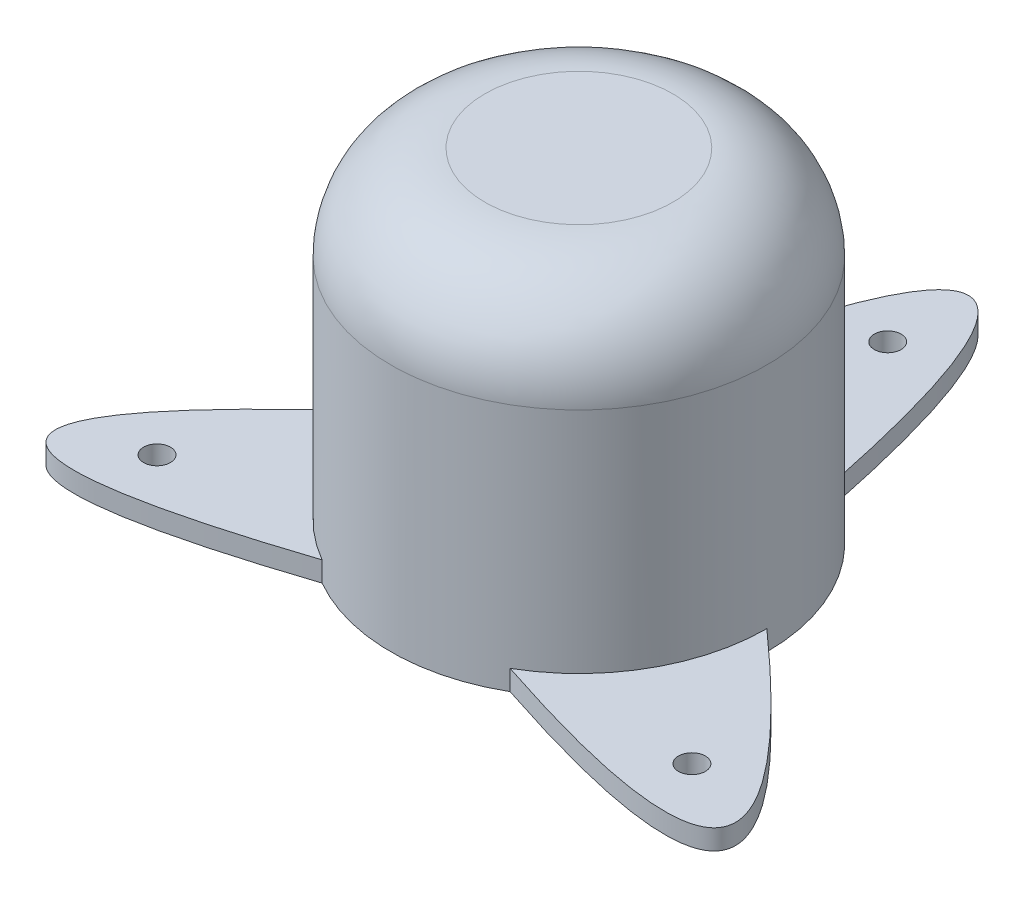
ISO-10303-21;
HEADER;
FILE_DESCRIPTION(('STEP AP214'),'2;1');
FILE_NAME('part.step','',(''),(''),'','','');
FILE_SCHEMA(('AUTOMOTIVE_DESIGN { 1 0 10303 214 1 1 1 1 }'));
ENDSEC;
DATA;
#1=APPLICATION_CONTEXT('core data for automotive mechanical design processes');
#2=APPLICATION_PROTOCOL_DEFINITION('international standard','automotive_design',2000,#1);
#3=PRODUCT_CONTEXT('',#1,'mechanical');
#4=PRODUCT('Part','Part','',(#3));
#5=PRODUCT_RELATED_PRODUCT_CATEGORY('part','',(#4));
#6=PRODUCT_DEFINITION_FORMATION('','',#4);
#7=PRODUCT_DEFINITION_CONTEXT('part definition',#1,'design');
#8=PRODUCT_DEFINITION('design','',#6,#7);
#9=PRODUCT_DEFINITION_SHAPE('','',#8);
#10=(LENGTH_UNIT() NAMED_UNIT(*) SI_UNIT(.MILLI.,.METRE.));
#11=(NAMED_UNIT(*) PLANE_ANGLE_UNIT() SI_UNIT($,.RADIAN.));
#12=(NAMED_UNIT(*) SI_UNIT($,.STERADIAN.) SOLID_ANGLE_UNIT());
#13=UNCERTAINTY_MEASURE_WITH_UNIT(LENGTH_MEASURE(1.E-05),#10,'distance_accuracy_value','');
#14=(GEOMETRIC_REPRESENTATION_CONTEXT(3) GLOBAL_UNCERTAINTY_ASSIGNED_CONTEXT((#13)) GLOBAL_UNIT_ASSIGNED_CONTEXT((#10,
#11,#12)) REPRESENTATION_CONTEXT('',''));
#15=CARTESIAN_POINT('',(0.,0.,0.));
#16=DIRECTION('',(0.,0.,1.));
#17=DIRECTION('',(1.,0.,0.));
#18=AXIS2_PLACEMENT_3D('',#15,#16,#17);
#19=CARTESIAN_POINT('',(16.6076846737816,31.9230809882193,46.6666691772413));
#20=DIRECTION('',(0.,1.,0.));
#21=DIRECTION('',(0.,0.,1.));
#22=AXIS2_PLACEMENT_3D('',#19,#20,#21);
#23=PLANE('',#22);
#24=CARTESIAN_POINT('',(16.6076846737816,31.9230809882193,23.6666691772413));
#25=DIRECTION('',(0.,1.,0.));
#26=DIRECTION('',(0.,0.,1.));
#27=AXIS2_PLACEMENT_3D('',#24,#25,#26);
#28=CIRCLE('',#27,1.);
#29=CARTESIAN_POINT('',(16.6076846737816,31.9230809882193,24.6666691772413));
#30=VERTEX_POINT('',#29);
#31=EDGE_CURVE('E114',#30,#30,#28,.T.);
#32=ORIENTED_EDGE('',*,*,#31,.F.);
#33=EDGE_LOOP('',(#32));
#34=FACE_BOUND('',#33,.T.);
#35=CARTESIAN_POINT('',(9.60768467378161,31.9230809882193,34.5423135242592));
#36=CARTESIAN_POINT('',(16.6076846737816,31.9230809882193,0.791024830223509));
#37=CARTESIAN_POINT('',(23.6076846737816,31.9230809882193,34.5423135242592));
#38=B_SPLINE_CURVE_WITH_KNOTS('',2,(#35,#36,#37),.UNSPECIFIED.,.F.,.F.,(3,3),(0.,1.),.UNSPECIFIED.);
#39=CARTESIAN_POINT('',(9.60768467378163,31.9230809882193,34.5423135242592));
#40=VERTEX_POINT('',#39);
#41=CARTESIAN_POINT('',(23.6076846737816,31.9230809882193,34.5423135242592));
#42=VERTEX_POINT('',#41);
#43=EDGE_CURVE('E145',#40,#42,#38,.T.);
#44=ORIENTED_EDGE('',*,*,#43,.F.);
#45=CARTESIAN_POINT('',(16.6076846737816,31.9230809882193,46.6666691772413));
#46=DIRECTION('',(0.,-1.,0.));
#47=DIRECTION('',(-1.,0.,0.));
#48=AXIS2_PLACEMENT_3D('',#45,#46,#47);
#49=CIRCLE('',#48,14.);
#50=EDGE_CURVE('E11',#40,#42,#49,.T.);
#51=ORIENTED_EDGE('',*,*,#50,.T.);
#52=EDGE_LOOP('',(#44,#51));
#53=FACE_BOUND('',#52,.T.);
#54=ADVANCED_FACE('F38',(#34,#53),#23,.T.);
#55=CARTESIAN_POINT('',(36.5262689608237,31.9230809882193,58.1666691772413));
#56=DIRECTION('',(0.,1.,0.));
#57=DIRECTION('',(0.,0.,1.));
#58=AXIS2_PLACEMENT_3D('',#55,#56,#57);
#59=CIRCLE('',#58,1.);
#60=CARTESIAN_POINT('',(36.5262689608237,31.9230809882193,59.1666691772413));
#61=VERTEX_POINT('',#60);
#62=EDGE_CURVE('E170',#61,#61,#59,.T.);
#63=ORIENTED_EDGE('',*,*,#62,.F.);
#64=EDGE_LOOP('',(#63));
#65=FACE_BOUND('',#64,.T.);
#66=CARTESIAN_POINT('',(23.6076846737816,31.9230809882193,58.7910248302235));
#67=CARTESIAN_POINT('',(56.3371580932791,31.9230809882193,69.6044913507502));
#68=CARTESIAN_POINT('',(30.6076846737816,31.9230809882193,46.6666691772413));
#69=B_SPLINE_CURVE_WITH_KNOTS('',2,(#66,#67,#68),.UNSPECIFIED.,.F.,.F.,(3,3),(0.,1.),.UNSPECIFIED.);
#70=CARTESIAN_POINT('',(23.6076846737816,31.9230809882193,58.7910248302235));
#71=VERTEX_POINT('',#70);
#72=CARTESIAN_POINT('',(30.6076846737816,31.9230809882193,46.6666691772413));
#73=VERTEX_POINT('',#72);
#74=EDGE_CURVE('E139',#71,#73,#69,.T.);
#75=ORIENTED_EDGE('',*,*,#74,.T.);
#76=EDGE_CURVE('E48',#73,#71,#49,.T.);
#77=ORIENTED_EDGE('',*,*,#76,.T.);
#78=EDGE_LOOP('',(#75,#77));
#79=FACE_BOUND('',#78,.T.);
#80=ADVANCED_FACE('F157',(#65,#79),#23,.T.);
#81=DIRECTION('',(0.,-1.,0.));
#82=VECTOR('',#81,1.);
#83=SURFACE_OF_LINEAR_EXTRUSION('',#69,#82);
#84=CARTESIAN_POINT('',(23.6076846737816,30.4230809882193,58.7910248302235));
#85=CARTESIAN_POINT('',(56.3371580932791,30.4230809882193,69.6044913507502));
#86=CARTESIAN_POINT('',(30.6076846737816,30.4230809882193,46.6666691772413));
#87=B_SPLINE_CURVE_WITH_KNOTS('',2,(#84,#85,#86),.UNSPECIFIED.,.F.,.F.,(3,3),(0.,1.),.UNSPECIFIED.);
#88=CARTESIAN_POINT('',(23.6076846737816,30.4230809882193,58.7910248302235));
#89=VERTEX_POINT('',#88);
#90=CARTESIAN_POINT('',(30.6076846737816,30.4230809882193,46.6666691772413));
#91=VERTEX_POINT('',#90);
#92=EDGE_CURVE('E102',#89,#91,#87,.T.);
#93=ORIENTED_EDGE('',*,*,#92,.T.);
#94=DIRECTION('',(0.,-1.,0.));
#95=VECTOR('',#94,1.);
#96=CARTESIAN_POINT('',(30.6076846737816,31.9230809882193,46.6666691772413));
#97=LINE('',#96,#95);
#98=EDGE_CURVE('E42',#73,#91,#97,.T.);
#99=ORIENTED_EDGE('',*,*,#98,.F.);
#100=ORIENTED_EDGE('',*,*,#74,.F.);
#101=DIRECTION('',(0.,-1.,0.));
#102=VECTOR('',#101,1.);
#103=CARTESIAN_POINT('',(23.6076846737816,31.9230809882193,58.7910248302235));
#104=LINE('',#103,#102);
#105=EDGE_CURVE('E96',#71,#89,#104,.T.);
#106=ORIENTED_EDGE('',*,*,#105,.T.);
#107=EDGE_LOOP('',(#93,#99,#100,#106));
#108=FACE_BOUND('',#107,.T.);
#109=ADVANCED_FACE('F153',(#108),#83,.F.);
#110=DIRECTION('',(0.,-1.,0.));
#111=VECTOR('',#110,1.);
#112=SURFACE_OF_LINEAR_EXTRUSION('',#38,#111);
#113=CARTESIAN_POINT('',(9.60768467378161,30.4230809882193,34.5423135242592));
#114=CARTESIAN_POINT('',(16.6076846737816,30.4230809882193,0.791024830223509));
#115=CARTESIAN_POINT('',(23.6076846737816,30.4230809882193,34.5423135242592));
#116=B_SPLINE_CURVE_WITH_KNOTS('',2,(#113,#114,#115),.UNSPECIFIED.,.F.,.F.,(3,3),(0.,1.),.UNSPECIFIED.);
#117=CARTESIAN_POINT('',(9.60768467378163,30.4230809882193,34.5423135242592));
#118=VERTEX_POINT('',#117);
#119=CARTESIAN_POINT('',(23.6076846737816,30.4230809882193,34.5423135242592));
#120=VERTEX_POINT('',#119);
#121=EDGE_CURVE('E188',#118,#120,#116,.T.);
#122=ORIENTED_EDGE('',*,*,#121,.F.);
#123=DIRECTION('',(0.,-1.,0.));
#124=VECTOR('',#123,1.);
#125=CARTESIAN_POINT('',(9.60768467378163,31.9230809882193,34.5423135242592));
#126=LINE('',#125,#124);
#127=EDGE_CURVE('E118',#40,#118,#126,.T.);
#128=ORIENTED_EDGE('',*,*,#127,.F.);
#129=ORIENTED_EDGE('',*,*,#43,.T.);
#130=DIRECTION('',(0.,-1.,0.));
#131=VECTOR('',#130,1.);
#132=CARTESIAN_POINT('',(23.6076846737816,31.9230809882193,34.5423135242592));
#133=LINE('',#132,#131);
#134=EDGE_CURVE('E119',#42,#120,#133,.T.);
#135=ORIENTED_EDGE('',*,*,#134,.T.);
#136=EDGE_LOOP('',(#122,#128,#129,#135));
#137=FACE_BOUND('',#136,.T.);
#138=ADVANCED_FACE('F156',(#137),#112,.T.);
#139=CARTESIAN_POINT('',(2.60768467378162,31.9230809882193,46.6666691772413));
#140=CARTESIAN_POINT('',(-23.1217887457159,31.9230809882193,69.6044913507502));
#141=CARTESIAN_POINT('',(9.60768467378161,31.9230809882193,58.7910248302235));
#142=B_SPLINE_CURVE_WITH_KNOTS('',2,(#139,#140,#141),.UNSPECIFIED.,.F.,.F.,(3,3),(0.,1.),.UNSPECIFIED.);
#143=DIRECTION('',(0.,-1.,0.));
#144=VECTOR('',#143,1.);
#145=SURFACE_OF_LINEAR_EXTRUSION('',#142,#144);
#146=CARTESIAN_POINT('',(2.60768467378162,30.4230809882193,46.6666691772413));
#147=CARTESIAN_POINT('',(-23.1217887457159,30.4230809882193,69.6044913507502));
#148=CARTESIAN_POINT('',(9.60768467378161,30.4230809882193,58.7910248302235));
#149=B_SPLINE_CURVE_WITH_KNOTS('',2,(#146,#147,#148),.UNSPECIFIED.,.F.,.F.,(3,3),(0.,1.),.UNSPECIFIED.);
#150=CARTESIAN_POINT('',(2.60768467378162,30.4230809882193,46.6666691772413));
#151=VERTEX_POINT('',#150);
#152=CARTESIAN_POINT('',(9.60768467378161,30.4230809882193,58.7910248302235));
#153=VERTEX_POINT('',#152);
#154=EDGE_CURVE('E79',#151,#153,#149,.T.);
#155=ORIENTED_EDGE('',*,*,#154,.T.);
#156=DIRECTION('',(0.,-1.,0.));
#157=VECTOR('',#156,1.);
#158=CARTESIAN_POINT('',(9.60768467378161,31.9230809882193,58.7910248302235));
#159=LINE('',#158,#157);
#160=CARTESIAN_POINT('',(9.60768467378161,31.9230809882193,58.7910248302235));
#161=VERTEX_POINT('',#160);
#162=EDGE_CURVE('E83',#161,#153,#159,.T.);
#163=ORIENTED_EDGE('',*,*,#162,.F.);
#164=CARTESIAN_POINT('',(2.60768467378162,31.9230809882193,46.6666691772413));
#165=VERTEX_POINT('',#164);
#166=EDGE_CURVE('E165',#165,#161,#142,.T.);
#167=ORIENTED_EDGE('',*,*,#166,.F.);
#168=DIRECTION('',(0.,-1.,0.));
#169=VECTOR('',#168,1.);
#170=CARTESIAN_POINT('',(2.60768467378162,31.9230809882193,46.6666691772413));
#171=LINE('',#170,#169);
#172=EDGE_CURVE('E84',#165,#151,#171,.T.);
#173=ORIENTED_EDGE('',*,*,#172,.T.);
#174=EDGE_LOOP('',(#155,#163,#167,#173));
#175=FACE_BOUND('',#174,.T.);
#176=ADVANCED_FACE('F81',(#175),#145,.F.);
#177=CARTESIAN_POINT('',(36.5262689608237,31.9230809882193,58.1666691772413));
#178=DIRECTION('',(0.,-1.,0.));
#179=DIRECTION('',(0.,0.,-1.));
#180=AXIS2_PLACEMENT_3D('',#177,#178,#179);
#181=CYLINDRICAL_SURFACE('',#180,1.);
#182=ORIENTED_EDGE('',*,*,#62,.T.);
#183=EDGE_LOOP('',(#182));
#184=FACE_BOUND('',#183,.T.);
#185=CARTESIAN_POINT('',(36.5262689608237,30.4230809882193,58.1666691772413));
#186=DIRECTION('',(0.,1.,0.));
#187=DIRECTION('',(0.,0.,1.));
#188=AXIS2_PLACEMENT_3D('',#185,#186,#187);
#189=CIRCLE('',#188,1.);
#190=CARTESIAN_POINT('',(36.5262689608237,30.4230809882193,59.1666691772413));
#191=VERTEX_POINT('',#190);
#192=EDGE_CURVE('E103',#191,#191,#189,.T.);
#193=ORIENTED_EDGE('',*,*,#192,.F.);
#194=EDGE_LOOP('',(#193));
#195=FACE_BOUND('',#194,.T.);
#196=ADVANCED_FACE('F163',(#184,#195),#181,.F.);
#197=CARTESIAN_POINT('',(16.6076846737816,31.9230809882193,46.6666691772413));
#198=DIRECTION('',(0.,-1.,0.));
#199=DIRECTION('',(0.,0.,-1.));
#200=AXIS2_PLACEMENT_3D('',#197,#198,#199);
#201=CYLINDRICAL_SURFACE('',#200,14.);
#202=CARTESIAN_POINT('',(16.6076846737816,30.4230809882193,46.6666691772413));
#203=DIRECTION('',(0.,1.,0.));
#204=DIRECTION('',(0.,0.,1.));
#205=AXIS2_PLACEMENT_3D('',#202,#203,#204);
#206=CIRCLE('',#205,14.);
#207=EDGE_CURVE('E88',#153,#89,#206,.T.);
#208=ORIENTED_EDGE('',*,*,#207,.T.);
#209=ORIENTED_EDGE('',*,*,#105,.F.);
#210=ORIENTED_EDGE('',*,*,#76,.F.);
#211=ORIENTED_EDGE('',*,*,#98,.T.);
#212=CARTESIAN_POINT('',(16.6076846737816,30.4230809882193,46.6666691772413));
#213=DIRECTION('',(0.,1.,0.));
#214=DIRECTION('',(0.,0.,1.));
#215=AXIS2_PLACEMENT_3D('',#212,#213,#214);
#216=CIRCLE('',#215,14.);
#217=EDGE_CURVE('E183',#91,#120,#216,.T.);
#218=ORIENTED_EDGE('',*,*,#217,.T.);
#219=ORIENTED_EDGE('',*,*,#134,.F.);
#220=ORIENTED_EDGE('',*,*,#50,.F.);
#221=ORIENTED_EDGE('',*,*,#127,.T.);
#222=CARTESIAN_POINT('',(16.6076846737816,30.4230809882193,46.6666691772413));
#223=DIRECTION('',(0.,1.,0.));
#224=DIRECTION('',(0.,0.,1.));
#225=AXIS2_PLACEMENT_3D('',#222,#223,#224);
#226=CIRCLE('',#225,14.);
#227=EDGE_CURVE('E89',#118,#151,#226,.T.);
#228=ORIENTED_EDGE('',*,*,#227,.T.);
#229=ORIENTED_EDGE('',*,*,#172,.F.);
#230=EDGE_CURVE('E50',#161,#165,#49,.T.);
#231=ORIENTED_EDGE('',*,*,#230,.F.);
#232=ORIENTED_EDGE('',*,*,#162,.T.);
#233=EDGE_LOOP('',(#208,#209,#210,#211,#218,#219,#220,#221,#228,#229,#231,#232));
#234=FACE_BOUND('',#233,.T.);
#235=CARTESIAN_POINT('',(16.6076846737816,48.9230809882193,46.6666691772413));
#236=DIRECTION('',(0.,-1.,0.));
#237=DIRECTION('',(-1.,0.,0.));
#238=AXIS2_PLACEMENT_3D('',#235,#236,#237);
#239=CIRCLE('',#238,14.);
#240=CARTESIAN_POINT('',(2.60768467378162,48.9230809882193,46.6666691772413));
#241=VERTEX_POINT('',#240);
#242=EDGE_CURVE('E133',#241,#241,#239,.T.);
#243=ORIENTED_EDGE('',*,*,#242,.T.);
#244=EDGE_LOOP('',(#243));
#245=FACE_BOUND('',#244,.T.);
#246=ADVANCED_FACE('F92',(#234,#245),#201,.T.);
#247=CARTESIAN_POINT('',(16.6076846737816,31.9230809882193,23.6666691772413));
#248=DIRECTION('',(0.,-1.,0.));
#249=DIRECTION('',(0.,0.,-1.));
#250=AXIS2_PLACEMENT_3D('',#247,#248,#249);
#251=CYLINDRICAL_SURFACE('',#250,1.);
#252=ORIENTED_EDGE('',*,*,#31,.T.);
#253=EDGE_LOOP('',(#252));
#254=FACE_BOUND('',#253,.T.);
#255=CARTESIAN_POINT('',(16.6076846737816,30.4230809882193,23.6666691772413));
#256=DIRECTION('',(0.,1.,0.));
#257=DIRECTION('',(0.,0.,1.));
#258=AXIS2_PLACEMENT_3D('',#255,#256,#257);
#259=CIRCLE('',#258,1.);
#260=CARTESIAN_POINT('',(16.6076846737816,30.4230809882193,24.6666691772413));
#261=VERTEX_POINT('',#260);
#262=EDGE_CURVE('E136',#261,#261,#259,.T.);
#263=ORIENTED_EDGE('',*,*,#262,.F.);
#264=EDGE_LOOP('',(#263));
#265=FACE_BOUND('',#264,.T.);
#266=ADVANCED_FACE('F40',(#254,#265),#251,.F.);
#267=CARTESIAN_POINT('',(-3.31089961326049,31.9230809882193,58.1666691772413));
#268=DIRECTION('',(0.,-1.,0.));
#269=DIRECTION('',(0.,0.,-1.));
#270=AXIS2_PLACEMENT_3D('',#267,#268,#269);
#271=CYLINDRICAL_SURFACE('',#270,1.);
#272=CARTESIAN_POINT('',(-3.31089961326049,31.9230809882193,58.1666691772413));
#273=DIRECTION('',(0.,1.,0.));
#274=DIRECTION('',(0.,0.,1.));
#275=AXIS2_PLACEMENT_3D('',#272,#273,#274);
#276=CIRCLE('',#275,1.);
#277=CARTESIAN_POINT('',(-3.31089961326049,31.9230809882193,59.1666691772413));
#278=VERTEX_POINT('',#277);
#279=EDGE_CURVE('E115',#278,#278,#276,.T.);
#280=ORIENTED_EDGE('',*,*,#279,.T.);
#281=EDGE_LOOP('',(#280));
#282=FACE_BOUND('',#281,.T.);
#283=CARTESIAN_POINT('',(-3.31089961326049,30.4230809882193,58.1666691772413));
#284=DIRECTION('',(0.,1.,0.));
#285=DIRECTION('',(0.,0.,1.));
#286=AXIS2_PLACEMENT_3D('',#283,#284,#285);
#287=CIRCLE('',#286,1.);
#288=CARTESIAN_POINT('',(-3.31089961326049,30.4230809882193,59.1666691772413));
#289=VERTEX_POINT('',#288);
#290=EDGE_CURVE('E106',#289,#289,#287,.T.);
#291=ORIENTED_EDGE('',*,*,#290,.F.);
#292=EDGE_LOOP('',(#291));
#293=FACE_BOUND('',#292,.T.);
#294=ADVANCED_FACE('F220',(#282,#293),#271,.F.);
#295=ORIENTED_EDGE('',*,*,#166,.T.);
#296=ORIENTED_EDGE('',*,*,#230,.T.);
#297=EDGE_LOOP('',(#295,#296));
#298=FACE_BOUND('',#297,.T.);
#299=ORIENTED_EDGE('',*,*,#279,.F.);
#300=EDGE_LOOP('',(#299));
#301=FACE_BOUND('',#300,.T.);
#302=ADVANCED_FACE('F211',(#298,#301),#23,.T.);
#303=CARTESIAN_POINT('',(16.6076846737816,30.4230809882193,46.6666691772413));
#304=DIRECTION('',(0.,1.,0.));
#305=DIRECTION('',(0.,0.,1.));
#306=AXIS2_PLACEMENT_3D('',#303,#304,#305);
#307=PLANE('',#306);
#308=ORIENTED_EDGE('',*,*,#262,.T.);
#309=EDGE_LOOP('',(#308));
#310=FACE_BOUND('',#309,.T.);
#311=ORIENTED_EDGE('',*,*,#92,.F.);
#312=ORIENTED_EDGE('',*,*,#207,.F.);
#313=ORIENTED_EDGE('',*,*,#154,.F.);
#314=ORIENTED_EDGE('',*,*,#227,.F.);
#315=ORIENTED_EDGE('',*,*,#121,.T.);
#316=ORIENTED_EDGE('',*,*,#217,.F.);
#317=EDGE_LOOP('',(#311,#312,#313,#314,#315,#316));
#318=FACE_BOUND('',#317,.T.);
#319=ORIENTED_EDGE('',*,*,#192,.T.);
#320=EDGE_LOOP('',(#319));
#321=FACE_BOUND('',#320,.T.);
#322=ORIENTED_EDGE('',*,*,#290,.T.);
#323=EDGE_LOOP('',(#322));
#324=FACE_BOUND('',#323,.T.);
#325=ADVANCED_FACE('F99',(#310,#318,#321,#324),#307,.F.);
#326=CARTESIAN_POINT('',(16.6076846737816,48.9230809882193,46.6666691772413));
#327=DIRECTION('',(0.,-1.,0.));
#328=DIRECTION('',(-1.,0.,0.));
#329=AXIS2_PLACEMENT_3D('',#326,#327,#328);
#330=TOROIDAL_SURFACE('',#329,7.,7.);
#331=CARTESIAN_POINT('',(16.6076846737816,55.9230809882193,46.6666691772413));
#332=DIRECTION('',(0.,-1.,0.));
#333=DIRECTION('',(-1.,0.,0.));
#334=AXIS2_PLACEMENT_3D('',#331,#332,#333);
#335=CIRCLE('',#334,7.);
#336=CARTESIAN_POINT('',(9.60768467378162,55.9230809882193,46.6666691772413));
#337=VERTEX_POINT('',#336);
#338=EDGE_CURVE('E130',#337,#337,#335,.T.);
#339=ORIENTED_EDGE('',*,*,#338,.T.);
#340=EDGE_LOOP('',(#339));
#341=FACE_BOUND('',#340,.T.);
#342=ORIENTED_EDGE('',*,*,#242,.F.);
#343=EDGE_LOOP('',(#342));
#344=FACE_BOUND('',#343,.T.);
#345=ADVANCED_FACE('F225',(#341,#344),#330,.T.);
#346=CARTESIAN_POINT('',(9.60768467378162,55.9230809882193,46.6666691772413));
#347=DIRECTION('',(0.,1.,0.));
#348=DIRECTION('',(1.,0.,0.));
#349=AXIS2_PLACEMENT_3D('',#346,#347,#348);
#350=PLANE('',#349);
#351=ORIENTED_EDGE('',*,*,#338,.F.);
#352=EDGE_LOOP('',(#351));
#353=FACE_BOUND('',#352,.T.);
#354=ADVANCED_FACE('F308',(#353),#350,.T.);
#355=CLOSED_SHELL('',(#54,#80,#109,#138,#176,#196,#246,#266,#294,#302,#325,#345,#354));
#356=MANIFOLD_SOLID_BREP('B2',#355);
#357=ADVANCED_BREP_SHAPE_REPRESENTATION('',(#18,#356),#14);
#358=SHAPE_DEFINITION_REPRESENTATION(#9,#357);
ENDSEC;
END-ISO-10303-21;
